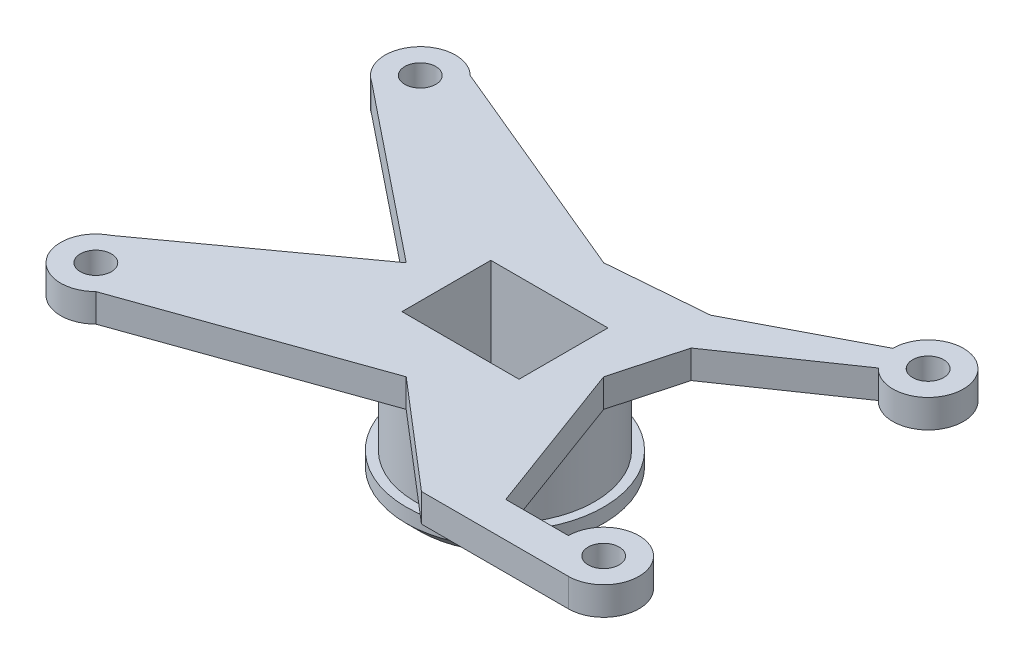
ISO-10303-21;
HEADER;
FILE_DESCRIPTION(('STEP AP214'),'2;1');
FILE_NAME('part.step','',(''),(''),'','','');
FILE_SCHEMA(('AUTOMOTIVE_DESIGN { 1 0 10303 214 1 1 1 1 }'));
ENDSEC;
DATA;
#1=APPLICATION_CONTEXT('core data for automotive mechanical design processes');
#2=APPLICATION_PROTOCOL_DEFINITION('international standard','automotive_design',2000,#1);
#3=PRODUCT_CONTEXT('',#1,'mechanical');
#4=PRODUCT('Part','Part','',(#3));
#5=PRODUCT_RELATED_PRODUCT_CATEGORY('part','',(#4));
#6=PRODUCT_DEFINITION_FORMATION('','',#4);
#7=PRODUCT_DEFINITION_CONTEXT('part definition',#1,'design');
#8=PRODUCT_DEFINITION('design','',#6,#7);
#9=PRODUCT_DEFINITION_SHAPE('','',#8);
#10=(LENGTH_UNIT() NAMED_UNIT(*) SI_UNIT(.MILLI.,.METRE.));
#11=(NAMED_UNIT(*) PLANE_ANGLE_UNIT() SI_UNIT($,.RADIAN.));
#12=(NAMED_UNIT(*) SI_UNIT($,.STERADIAN.) SOLID_ANGLE_UNIT());
#13=UNCERTAINTY_MEASURE_WITH_UNIT(LENGTH_MEASURE(1.E-05),#10,'distance_accuracy_value','');
#14=(GEOMETRIC_REPRESENTATION_CONTEXT(3) GLOBAL_UNCERTAINTY_ASSIGNED_CONTEXT((#13)) GLOBAL_UNIT_ASSIGNED_CONTEXT((#10,
#11,#12)) REPRESENTATION_CONTEXT('',''));
#15=CARTESIAN_POINT('',(0.,0.,0.));
#16=DIRECTION('',(0.,0.,1.));
#17=DIRECTION('',(1.,0.,0.));
#18=AXIS2_PLACEMENT_3D('',#15,#16,#17);
#19=CARTESIAN_POINT('',(0.,-5.,0.));
#20=DIRECTION('',(0.,1.,0.));
#21=DIRECTION('',(0.,0.,1.));
#22=AXIS2_PLACEMENT_3D('',#19,#20,#21);
#23=CYLINDRICAL_SURFACE('',#22,6.35);
#24=CARTESIAN_POINT('',(0.,0.35000000000001,0.));
#25=DIRECTION('',(0.,1.,0.));
#26=DIRECTION('',(0.,0.,1.));
#27=AXIS2_PLACEMENT_3D('',#24,#25,#26);
#28=CIRCLE('',#27,6.35);
#29=CARTESIAN_POINT('',(0.,0.35000000000001,6.35));
#30=VERTEX_POINT('',#29);
#31=EDGE_CURVE('E11',#30,#30,#28,.F.);
#32=ORIENTED_EDGE('',*,*,#31,.T.);
#33=EDGE_LOOP('',(#32));
#34=FACE_BOUND('',#33,.T.);
#35=CARTESIAN_POINT('',(0.,-5.,0.));
#36=DIRECTION('',(0.,1.,0.));
#37=DIRECTION('',(0.,0.,1.));
#38=AXIS2_PLACEMENT_3D('',#35,#36,#37);
#39=CIRCLE('',#38,6.35);
#40=CARTESIAN_POINT('',(0.,-5.,6.35));
#41=VERTEX_POINT('',#40);
#42=EDGE_CURVE('E293',#41,#41,#39,.T.);
#43=ORIENTED_EDGE('',*,*,#42,.T.);
#44=EDGE_LOOP('',(#43));
#45=FACE_BOUND('',#44,.T.);
#46=ADVANCED_FACE('F47',(#34,#45),#23,.T.);
#47=CARTESIAN_POINT('',(0.,-7.,0.));
#48=DIRECTION('',(0.,1.,0.));
#49=DIRECTION('',(0.,0.,1.));
#50=AXIS2_PLACEMENT_3D('',#47,#48,#49);
#51=CYLINDRICAL_SURFACE('',#50,7.);
#52=CARTESIAN_POINT('',(0.,-6.,0.));
#53=DIRECTION('',(0.,1.,0.));
#54=DIRECTION('',(0.,0.,1.));
#55=AXIS2_PLACEMENT_3D('',#52,#53,#54);
#56=CIRCLE('',#55,7.);
#57=CARTESIAN_POINT('',(0.,-6.,7.));
#58=VERTEX_POINT('',#57);
#59=EDGE_CURVE('E297',#58,#58,#56,.T.);
#60=ORIENTED_EDGE('',*,*,#59,.T.);
#61=EDGE_LOOP('',(#60));
#62=FACE_BOUND('',#61,.T.);
#63=CARTESIAN_POINT('',(0.,-5.,0.));
#64=DIRECTION('',(0.,1.,0.));
#65=DIRECTION('',(0.,0.,1.));
#66=AXIS2_PLACEMENT_3D('',#63,#64,#65);
#67=CIRCLE('',#66,7.);
#68=CARTESIAN_POINT('',(0.,-5.,7.));
#69=VERTEX_POINT('',#68);
#70=EDGE_CURVE('E281',#69,#69,#67,.T.);
#71=ORIENTED_EDGE('',*,*,#70,.F.);
#72=EDGE_LOOP('',(#71));
#73=FACE_BOUND('',#72,.T.);
#74=ADVANCED_FACE('F522',(#62,#73),#51,.T.);
#75=CARTESIAN_POINT('',(0.,-7.,0.));
#76=DIRECTION('',(0.,1.,0.));
#77=DIRECTION('',(0.,0.,1.));
#78=AXIS2_PLACEMENT_3D('',#75,#76,#77);
#79=PLANE('',#78);
#80=DIRECTION('',(-1.,0.,0.));
#81=VECTOR('',#80,1.);
#82=CARTESIAN_POINT('',(-4.15,-7.,3.15));
#83=LINE('',#82,#81);
#84=CARTESIAN_POINT('',(4.15,-7.,3.15));
#85=VERTEX_POINT('',#84);
#86=CARTESIAN_POINT('',(-4.15,-7.,3.15));
#87=VERTEX_POINT('',#86);
#88=EDGE_CURVE('E265',#85,#87,#83,.T.);
#89=ORIENTED_EDGE('',*,*,#88,.F.);
#90=DIRECTION('',(0.,0.,1.));
#91=VECTOR('',#90,1.);
#92=CARTESIAN_POINT('',(4.15,-7.,-3.15));
#93=LINE('',#92,#91);
#94=CARTESIAN_POINT('',(4.15,-7.,-3.15));
#95=VERTEX_POINT('',#94);
#96=EDGE_CURVE('E259',#95,#85,#93,.T.);
#97=ORIENTED_EDGE('',*,*,#96,.F.);
#98=DIRECTION('',(1.,0.,0.));
#99=VECTOR('',#98,1.);
#100=CARTESIAN_POINT('',(-4.15,-7.,-3.15));
#101=LINE('',#100,#99);
#102=CARTESIAN_POINT('',(-4.15,-7.,-3.15));
#103=VERTEX_POINT('',#102);
#104=EDGE_CURVE('E273',#103,#95,#101,.T.);
#105=ORIENTED_EDGE('',*,*,#104,.F.);
#106=DIRECTION('',(0.,0.,-1.));
#107=VECTOR('',#106,1.);
#108=CARTESIAN_POINT('',(-4.15,-7.,-3.15));
#109=LINE('',#108,#107);
#110=EDGE_CURVE('E269',#87,#103,#109,.T.);
#111=ORIENTED_EDGE('',*,*,#110,.F.);
#112=EDGE_LOOP('',(#89,#97,#105,#111));
#113=FACE_BOUND('',#112,.T.);
#114=CARTESIAN_POINT('',(0.,-7.,0.));
#115=DIRECTION('',(0.,1.,0.));
#116=DIRECTION('',(0.,0.,1.));
#117=AXIS2_PLACEMENT_3D('',#114,#115,#116);
#118=CIRCLE('',#117,5.99999999999999);
#119=CARTESIAN_POINT('',(0.,-7.,5.99999999999999));
#120=VERTEX_POINT('',#119);
#121=EDGE_CURVE('E301',#120,#120,#118,.F.);
#122=ORIENTED_EDGE('',*,*,#121,.T.);
#123=EDGE_LOOP('',(#122));
#124=FACE_BOUND('',#123,.T.);
#125=ADVANCED_FACE('F506',(#113,#124),#79,.F.);
#126=CARTESIAN_POINT('',(0.,-5.,0.));
#127=DIRECTION('',(0.,1.,0.));
#128=DIRECTION('',(0.,0.,1.));
#129=AXIS2_PLACEMENT_3D('',#126,#127,#128);
#130=PLANE('',#129);
#131=ORIENTED_EDGE('',*,*,#42,.F.);
#132=EDGE_LOOP('',(#131));
#133=FACE_BOUND('',#132,.T.);
#134=ORIENTED_EDGE('',*,*,#70,.T.);
#135=EDGE_LOOP('',(#134));
#136=FACE_BOUND('',#135,.T.);
#137=ADVANCED_FACE('F538',(#133,#136),#130,.T.);
#138=CARTESIAN_POINT('',(0.,-6.,0.));
#139=DIRECTION('',(0.,1.,0.));
#140=DIRECTION('',(0.,0.,1.));
#141=AXIS2_PLACEMENT_3D('',#138,#139,#140);
#142=CONICAL_SURFACE('',#141,7.,0.78539816339745);
#143=ORIENTED_EDGE('',*,*,#121,.F.);
#144=EDGE_LOOP('',(#143));
#145=FACE_BOUND('',#144,.T.);
#146=ORIENTED_EDGE('',*,*,#59,.F.);
#147=EDGE_LOOP('',(#146));
#148=FACE_BOUND('',#147,.T.);
#149=ADVANCED_FACE('F534',(#145,#148),#142,.T.);
#150=CARTESIAN_POINT('',(0.,1.00000000000002,0.));
#151=DIRECTION('',(0.,1.,0.));
#152=DIRECTION('',(0.,0.,1.));
#153=AXIS2_PLACEMENT_3D('',#150,#151,#152);
#154=CONICAL_SURFACE('',#153,7.,0.785398163397443);
#155=ORIENTED_EDGE('',*,*,#31,.F.);
#156=EDGE_LOOP('',(#155));
#157=FACE_BOUND('',#156,.T.);
#158=CARTESIAN_POINT('',(0.,1.00000000000002,0.));
#159=DIRECTION('',(0.,1.,0.));
#160=DIRECTION('',(0.,0.,1.));
#161=AXIS2_PLACEMENT_3D('',#158,#159,#160);
#162=CIRCLE('',#161,7.);
#163=CARTESIAN_POINT('',(0.,1.00000000000002,7.));
#164=VERTEX_POINT('',#163);
#165=CARTESIAN_POINT('',(7.,1.,0.));
#166=VERTEX_POINT('',#165);
#167=EDGE_CURVE('E57',#164,#166,#162,.T.);
#168=ORIENTED_EDGE('',*,*,#167,.F.);
#169=CARTESIAN_POINT('',(0.,1.,0.));
#170=DIRECTION('',(0.,1.,0.));
#171=DIRECTION('',(0.,0.,1.));
#172=AXIS2_PLACEMENT_3D('',#169,#170,#171);
#173=CIRCLE('',#172,6.99999999999998);
#174=CARTESIAN_POINT('',(-7.,1.00000000000002,0.));
#175=VERTEX_POINT('',#174);
#176=EDGE_CURVE('E255',#164,#175,#173,.F.);
#177=ORIENTED_EDGE('',*,*,#176,.T.);
#178=CARTESIAN_POINT('',(-2.36464493819089E-13,1.00000000000002,-7.));
#179=VERTEX_POINT('',#178);
#180=EDGE_CURVE('E260',#175,#179,#173,.F.);
#181=ORIENTED_EDGE('',*,*,#180,.T.);
#182=EDGE_CURVE('E261',#179,#166,#173,.F.);
#183=ORIENTED_EDGE('',*,*,#182,.T.);
#184=EDGE_LOOP('',(#168,#177,#181,#183));
#185=FACE_BOUND('',#184,.T.);
#186=ADVANCED_FACE('F50',(#157,#185),#154,.T.);
#187=CARTESIAN_POINT('',(4.15,2.,-3.15));
#188=DIRECTION('',(1.,0.,0.));
#189=DIRECTION('',(0.,0.,-1.));
#190=AXIS2_PLACEMENT_3D('',#187,#188,#189);
#191=PLANE('',#190);
#192=DIRECTION('',(0.,-1.,0.));
#193=VECTOR('',#192,1.);
#194=CARTESIAN_POINT('',(4.15,2.,-3.15));
#195=LINE('',#194,#193);
#196=CARTESIAN_POINT('',(4.15,3.,-3.15));
#197=VERTEX_POINT('',#196);
#198=EDGE_CURVE('E278',#197,#95,#195,.T.);
#199=ORIENTED_EDGE('',*,*,#198,.T.);
#200=ORIENTED_EDGE('',*,*,#96,.T.);
#201=DIRECTION('',(0.,-1.,0.));
#202=VECTOR('',#201,1.);
#203=CARTESIAN_POINT('',(4.15,2.,3.15));
#204=LINE('',#203,#202);
#205=CARTESIAN_POINT('',(4.15,3.,3.15));
#206=VERTEX_POINT('',#205);
#207=EDGE_CURVE('E277',#206,#85,#204,.T.);
#208=ORIENTED_EDGE('',*,*,#207,.F.);
#209=DIRECTION('',(0.,0.,-1.));
#210=VECTOR('',#209,1.);
#211=CARTESIAN_POINT('',(4.15,3.,3.15));
#212=LINE('',#211,#210);
#213=EDGE_CURVE('E453',#206,#197,#212,.T.);
#214=ORIENTED_EDGE('',*,*,#213,.T.);
#215=EDGE_LOOP('',(#199,#200,#208,#214));
#216=FACE_BOUND('',#215,.T.);
#217=ADVANCED_FACE('F500',(#216),#191,.F.);
#218=CARTESIAN_POINT('',(-4.15,2.,-3.15));
#219=DIRECTION('',(0.,0.,-1.));
#220=DIRECTION('',(-1.,0.,0.));
#221=AXIS2_PLACEMENT_3D('',#218,#219,#220);
#222=PLANE('',#221);
#223=DIRECTION('',(0.,-1.,0.));
#224=VECTOR('',#223,1.);
#225=CARTESIAN_POINT('',(-4.15,2.,-3.15));
#226=LINE('',#225,#224);
#227=CARTESIAN_POINT('',(-4.15,3.,-3.15));
#228=VERTEX_POINT('',#227);
#229=EDGE_CURVE('E282',#228,#103,#226,.T.);
#230=ORIENTED_EDGE('',*,*,#229,.T.);
#231=ORIENTED_EDGE('',*,*,#104,.T.);
#232=ORIENTED_EDGE('',*,*,#198,.F.);
#233=DIRECTION('',(-1.,0.,0.));
#234=VECTOR('',#233,1.);
#235=CARTESIAN_POINT('',(-4.15,3.,-3.15));
#236=LINE('',#235,#234);
#237=EDGE_CURVE('E483',#197,#228,#236,.T.);
#238=ORIENTED_EDGE('',*,*,#237,.T.);
#239=EDGE_LOOP('',(#230,#231,#232,#238));
#240=FACE_BOUND('',#239,.T.);
#241=ADVANCED_FACE('F511',(#240),#222,.F.);
#242=CARTESIAN_POINT('',(-4.15,2.,-3.15));
#243=DIRECTION('',(-1.,0.,0.));
#244=DIRECTION('',(0.,0.,1.));
#245=AXIS2_PLACEMENT_3D('',#242,#243,#244);
#246=PLANE('',#245);
#247=DIRECTION('',(0.,-1.,0.));
#248=VECTOR('',#247,1.);
#249=CARTESIAN_POINT('',(-4.15,2.,3.15));
#250=LINE('',#249,#248);
#251=CARTESIAN_POINT('',(-4.15,3.,3.15));
#252=VERTEX_POINT('',#251);
#253=EDGE_CURVE('E285',#252,#87,#250,.T.);
#254=ORIENTED_EDGE('',*,*,#253,.T.);
#255=ORIENTED_EDGE('',*,*,#110,.T.);
#256=ORIENTED_EDGE('',*,*,#229,.F.);
#257=DIRECTION('',(0.,0.,1.));
#258=VECTOR('',#257,1.);
#259=CARTESIAN_POINT('',(-4.15,3.,3.15));
#260=LINE('',#259,#258);
#261=EDGE_CURVE('E487',#228,#252,#260,.T.);
#262=ORIENTED_EDGE('',*,*,#261,.T.);
#263=EDGE_LOOP('',(#254,#255,#256,#262));
#264=FACE_BOUND('',#263,.T.);
#265=ADVANCED_FACE('F509',(#264),#246,.F.);
#266=CARTESIAN_POINT('',(-4.15,2.,3.15));
#267=DIRECTION('',(0.,0.,1.));
#268=DIRECTION('',(1.,0.,0.));
#269=AXIS2_PLACEMENT_3D('',#266,#267,#268);
#270=PLANE('',#269);
#271=ORIENTED_EDGE('',*,*,#207,.T.);
#272=ORIENTED_EDGE('',*,*,#88,.T.);
#273=ORIENTED_EDGE('',*,*,#253,.F.);
#274=DIRECTION('',(1.,0.,0.));
#275=VECTOR('',#274,1.);
#276=CARTESIAN_POINT('',(-4.15,3.,3.15));
#277=LINE('',#276,#275);
#278=EDGE_CURVE('E357',#252,#206,#277,.T.);
#279=ORIENTED_EDGE('',*,*,#278,.T.);
#280=EDGE_LOOP('',(#271,#272,#273,#279));
#281=FACE_BOUND('',#280,.T.);
#282=ADVANCED_FACE('F495',(#281),#270,.F.);
#283=CARTESIAN_POINT('',(-18.,1.,-12.));
#284=DIRECTION('',(0.,1.,0.));
#285=DIRECTION('',(0.,0.,1.));
#286=AXIS2_PLACEMENT_3D('',#283,#284,#285);
#287=PLANE('',#286);
#288=DIRECTION('',(-0.942282352549881,0.,0.334819306601429));
#289=VECTOR('',#288,1.);
#290=CARTESIAN_POINT('',(-16.2322330470336,1.,12.7677669529663));
#291=LINE('',#290,#289);
#292=CARTESIAN_POINT('',(-16.2322330470336,1.,12.7677669529663));
#293=VERTEX_POINT('',#292);
#294=EDGE_CURVE('E473',#164,#293,#291,.T.);
#295=ORIENTED_EDGE('',*,*,#294,.T.);
#296=CARTESIAN_POINT('',(-18.,1.,11.));
#297=DIRECTION('',(0.,1.,0.));
#298=DIRECTION('',(0.,0.,1.));
#299=AXIS2_PLACEMENT_3D('',#296,#297,#298);
#300=CIRCLE('',#299,2.5);
#301=CARTESIAN_POINT('',(-19.1248783853447,1.,8.76736733469558));
#302=VERTEX_POINT('',#301);
#303=EDGE_CURVE('E211',#302,#293,#300,.T.);
#304=ORIENTED_EDGE('',*,*,#303,.F.);
#305=DIRECTION('',(0.810345674789215,0.,-0.585952120356614));
#306=VECTOR('',#305,1.);
#307=CARTESIAN_POINT('',(-19.7677669529664,1.,9.23223304703364));
#308=LINE('',#307,#306);
#309=EDGE_CURVE('E64',#302,#175,#308,.T.);
#310=ORIENTED_EDGE('',*,*,#309,.T.);
#311=ORIENTED_EDGE('',*,*,#176,.F.);
#312=EDGE_LOOP('',(#295,#304,#310,#311));
#313=FACE_BOUND('',#312,.T.);
#314=CARTESIAN_POINT('',(-18.,1.,11.));
#315=DIRECTION('',(0.,1.,0.));
#316=DIRECTION('',(0.,0.,1.));
#317=AXIS2_PLACEMENT_3D('',#314,#315,#316);
#318=CIRCLE('',#317,1.1);
#319=CARTESIAN_POINT('',(-18.,1.,12.1));
#320=VERTEX_POINT('',#319);
#321=EDGE_CURVE('E196',#320,#320,#318,.T.);
#322=ORIENTED_EDGE('',*,*,#321,.T.);
#323=EDGE_LOOP('',(#322));
#324=FACE_BOUND('',#323,.T.);
#325=ADVANCED_FACE('F557',(#313,#324),#287,.F.);
#326=CARTESIAN_POINT('',(-18.,1.,-12.));
#327=DIRECTION('',(0.,1.,0.));
#328=DIRECTION('',(0.,0.,1.));
#329=AXIS2_PLACEMENT_3D('',#326,#327,#328);
#330=CIRCLE('',#329,2.5);
#331=CARTESIAN_POINT('',(-16.2322330470337,1.,-13.7677669529664));
#332=VERTEX_POINT('',#331);
#333=CARTESIAN_POINT('',(-19.340236025644,1.,-9.8896049195551));
#334=VERTEX_POINT('',#333);
#335=EDGE_CURVE('E446',#332,#334,#330,.T.);
#336=ORIENTED_EDGE('',*,*,#335,.F.);
#337=DIRECTION('',(0.922989355648171,0.,0.384825479094323));
#338=VECTOR('',#337,1.);
#339=CARTESIAN_POINT('',(-16.2322330470337,1.,-13.7677669529664));
#340=LINE('',#339,#338);
#341=EDGE_CURVE('E464',#332,#179,#340,.T.);
#342=ORIENTED_EDGE('',*,*,#341,.T.);
#343=ORIENTED_EDGE('',*,*,#180,.F.);
#344=DIRECTION('',(-0.780331300184989,0.,-0.625366342196001));
#345=VECTOR('',#344,1.);
#346=CARTESIAN_POINT('',(-19.7677669529664,1.,-10.2322330470336));
#347=LINE('',#346,#345);
#348=EDGE_CURVE('E467',#175,#334,#347,.T.);
#349=ORIENTED_EDGE('',*,*,#348,.T.);
#350=EDGE_LOOP('',(#336,#342,#343,#349));
#351=FACE_BOUND('',#350,.T.);
#352=CARTESIAN_POINT('',(-18.,1.,-12.));
#353=DIRECTION('',(0.,1.,0.));
#354=DIRECTION('',(0.,0.,1.));
#355=AXIS2_PLACEMENT_3D('',#352,#353,#354);
#356=CIRCLE('',#355,1.1);
#357=CARTESIAN_POINT('',(-18.,1.,-10.9));
#358=VERTEX_POINT('',#357);
#359=EDGE_CURVE('E442',#358,#358,#356,.T.);
#360=ORIENTED_EDGE('',*,*,#359,.T.);
#361=EDGE_LOOP('',(#360));
#362=FACE_BOUND('',#361,.T.);
#363=ADVANCED_FACE('F561',(#351,#362),#287,.F.);
#364=DIRECTION('',(0.886882623351324,0.,-0.461994818582928));
#365=VECTOR('',#364,1.);
#366=CARTESIAN_POINT('',(7.,1.,-7.57218074347219));
#367=LINE('',#366,#365);
#368=CARTESIAN_POINT('',(7.,1.,-7.57218074347219));
#369=VERTEX_POINT('',#368);
#370=CARTESIAN_POINT('',(15.5,1.,-12.));
#371=VERTEX_POINT('',#370);
#372=EDGE_CURVE('E458',#369,#371,#367,.T.);
#373=ORIENTED_EDGE('',*,*,#372,.T.);
#374=CARTESIAN_POINT('',(18.,1.,-12.));
#375=DIRECTION('',(0.,1.,0.));
#376=DIRECTION('',(0.,0.,1.));
#377=AXIS2_PLACEMENT_3D('',#374,#375,#376);
#378=CIRCLE('',#377,2.5);
#379=CARTESIAN_POINT('',(16.1924342957977,1.,-10.2729486906893));
#380=VERTEX_POINT('',#379);
#381=EDGE_CURVE('E419',#380,#371,#378,.T.);
#382=ORIENTED_EDGE('',*,*,#381,.F.);
#383=DIRECTION('',(-0.823968929567635,0.,0.566634982247977));
#384=VECTOR('',#383,1.);
#385=CARTESIAN_POINT('',(8.33451426127763,1.,-4.86913767368563));
#386=LINE('',#385,#384);
#387=CARTESIAN_POINT('',(8.33451426127763,1.,-4.86913767368563));
#388=VERTEX_POINT('',#387);
#389=EDGE_CURVE('E327',#380,#388,#386,.T.);
#390=ORIENTED_EDGE('',*,*,#389,.T.);
#391=DIRECTION('',(-0.264327992330558,0.,0.964432844977034));
#392=VECTOR('',#391,1.);
#393=CARTESIAN_POINT('',(7.,1.,0.));
#394=LINE('',#393,#392);
#395=EDGE_CURVE('E322',#388,#166,#394,.T.);
#396=ORIENTED_EDGE('',*,*,#395,.T.);
#397=ORIENTED_EDGE('',*,*,#182,.F.);
#398=DIRECTION('',(0.996675925490363,0.,-0.0814683960068446));
#399=VECTOR('',#398,1.);
#400=CARTESIAN_POINT('',(0.,1.,-7.));
#401=LINE('',#400,#399);
#402=EDGE_CURVE('E461',#179,#369,#401,.T.);
#403=ORIENTED_EDGE('',*,*,#402,.T.);
#404=EDGE_LOOP('',(#373,#382,#390,#396,#397,#403));
#405=FACE_BOUND('',#404,.T.);
#406=CARTESIAN_POINT('',(18.,1.,-12.));
#407=DIRECTION('',(0.,1.,0.));
#408=DIRECTION('',(0.,0.,1.));
#409=AXIS2_PLACEMENT_3D('',#406,#407,#408);
#410=CIRCLE('',#409,1.1);
#411=CARTESIAN_POINT('',(18.,1.,-10.9));
#412=VERTEX_POINT('',#411);
#413=EDGE_CURVE('E423',#412,#412,#410,.T.);
#414=ORIENTED_EDGE('',*,*,#413,.T.);
#415=EDGE_LOOP('',(#414));
#416=FACE_BOUND('',#415,.T.);
#417=ADVANCED_FACE('F323',(#405,#416),#287,.F.);
#418=CARTESIAN_POINT('',(15.5,-45.5825647127213,11.));
#419=DIRECTION('',(0.,0.,-1.));
#420=DIRECTION('',(-1.,0.,0.));
#421=AXIS2_PLACEMENT_3D('',#418,#419,#420);
#422=PLANE('',#421);
#423=DIRECTION('',(1.,0.,0.));
#424=VECTOR('',#423,1.);
#425=CARTESIAN_POINT('',(15.5,1.,11.));
#426=LINE('',#425,#424);
#427=CARTESIAN_POINT('',(11.058001897193,1.,11.));
#428=VERTEX_POINT('',#427);
#429=CARTESIAN_POINT('',(15.5,1.,11.));
#430=VERTEX_POINT('',#429);
#431=EDGE_CURVE('E401',#428,#430,#426,.T.);
#432=ORIENTED_EDGE('',*,*,#431,.F.);
#433=DIRECTION('',(0.,1.,0.));
#434=VECTOR('',#433,1.);
#435=CARTESIAN_POINT('',(11.058001897193,-45.5825647127213,11.));
#436=LINE('',#435,#434);
#437=CARTESIAN_POINT('',(11.058001897193,3.,11.));
#438=VERTEX_POINT('',#437);
#439=EDGE_CURVE('E247',#428,#438,#436,.T.);
#440=ORIENTED_EDGE('',*,*,#439,.T.);
#441=DIRECTION('',(-1.,0.,0.));
#442=VECTOR('',#441,1.);
#443=CARTESIAN_POINT('',(15.5,3.,11.));
#444=LINE('',#443,#442);
#445=CARTESIAN_POINT('',(15.5,3.,11.));
#446=VERTEX_POINT('',#445);
#447=EDGE_CURVE('E353',#446,#438,#444,.T.);
#448=ORIENTED_EDGE('',*,*,#447,.F.);
#449=DIRECTION('',(0.,1.,0.));
#450=VECTOR('',#449,1.);
#451=CARTESIAN_POINT('',(15.5,-45.5825647127213,11.));
#452=LINE('',#451,#450);
#453=EDGE_CURVE('E250',#430,#446,#452,.T.);
#454=ORIENTED_EDGE('',*,*,#453,.F.);
#455=EDGE_LOOP('',(#432,#440,#448,#454));
#456=FACE_BOUND('',#455,.T.);
#457=ADVANCED_FACE('F580',(#456),#422,.T.);
#458=CARTESIAN_POINT('',(11.058001897193,-45.5825647127213,11.));
#459=DIRECTION('',(0.938194447540681,0.,-0.346108622550547));
#460=DIRECTION('',(-0.346108622550547,0.,-0.938194447540681));
#461=AXIS2_PLACEMENT_3D('',#458,#459,#460);
#462=PLANE('',#461);
#463=DIRECTION('',(0.346108622550547,0.,0.938194447540681));
#464=VECTOR('',#463,1.);
#465=CARTESIAN_POINT('',(11.058001897193,1.,11.));
#466=LINE('',#465,#464);
#467=EDGE_CURVE('E313',#166,#428,#466,.T.);
#468=ORIENTED_EDGE('',*,*,#467,.F.);
#469=DIRECTION('',(0.,1.,0.));
#470=VECTOR('',#469,1.);
#471=CARTESIAN_POINT('',(7.,-45.5825647127213,0.));
#472=LINE('',#471,#470);
#473=CARTESIAN_POINT('',(7.,3.,0.));
#474=VERTEX_POINT('',#473);
#475=EDGE_CURVE('E244',#166,#474,#472,.T.);
#476=ORIENTED_EDGE('',*,*,#475,.T.);
#477=DIRECTION('',(-0.346108622550547,0.,-0.938194447540681));
#478=VECTOR('',#477,1.);
#479=CARTESIAN_POINT('',(11.058001897193,3.,11.));
#480=LINE('',#479,#478);
#481=EDGE_CURVE('E349',#438,#474,#480,.T.);
#482=ORIENTED_EDGE('',*,*,#481,.F.);
#483=ORIENTED_EDGE('',*,*,#439,.F.);
#484=EDGE_LOOP('',(#468,#476,#482,#483));
#485=FACE_BOUND('',#484,.T.);
#486=ADVANCED_FACE('F334',(#485),#462,.T.);
#487=CARTESIAN_POINT('',(7.,-45.5825647127213,0.));
#488=DIRECTION('',(0.964432844977034,0.,0.264327992330558));
#489=DIRECTION('',(0.264327992330558,0.,-0.964432844977034));
#490=AXIS2_PLACEMENT_3D('',#487,#488,#489);
#491=PLANE('',#490);
#492=ORIENTED_EDGE('',*,*,#395,.F.);
#493=DIRECTION('',(0.,1.,0.));
#494=VECTOR('',#493,1.);
#495=CARTESIAN_POINT('',(8.33451426127763,-45.5825647127213,-4.86913767368563));
#496=LINE('',#495,#494);
#497=CARTESIAN_POINT('',(8.33451426127763,3.,-4.86913767368563));
#498=VERTEX_POINT('',#497);
#499=EDGE_CURVE('E241',#388,#498,#496,.T.);
#500=ORIENTED_EDGE('',*,*,#499,.T.);
#501=DIRECTION('',(0.264327992330558,0.,-0.964432844977034));
#502=VECTOR('',#501,1.);
#503=CARTESIAN_POINT('',(7.,3.,0.));
#504=LINE('',#503,#502);
#505=EDGE_CURVE('E343',#474,#498,#504,.T.);
#506=ORIENTED_EDGE('',*,*,#505,.F.);
#507=ORIENTED_EDGE('',*,*,#475,.F.);
#508=EDGE_LOOP('',(#492,#500,#506,#507));
#509=FACE_BOUND('',#508,.T.);
#510=ADVANCED_FACE('F341',(#509),#491,.T.);
#511=CARTESIAN_POINT('',(8.33451426127763,-45.5825647127213,-4.86913767368563));
#512=DIRECTION('',(0.566634982247977,0.,0.823968929567635));
#513=DIRECTION('',(0.823968929567635,0.,-0.566634982247977));
#514=AXIS2_PLACEMENT_3D('',#511,#512,#513);
#515=PLANE('',#514);
#516=ORIENTED_EDGE('',*,*,#389,.F.);
#517=DIRECTION('',(0.,1.,0.));
#518=VECTOR('',#517,1.);
#519=CARTESIAN_POINT('',(16.1924342957977,-45.5825647127213,-10.2729486906893));
#520=LINE('',#519,#518);
#521=CARTESIAN_POINT('',(16.1924342957977,3.,-10.2729486906893));
#522=VERTEX_POINT('',#521);
#523=EDGE_CURVE('E238',#380,#522,#520,.T.);
#524=ORIENTED_EDGE('',*,*,#523,.T.);
#525=DIRECTION('',(0.823968929567635,0.,-0.566634982247977));
#526=VECTOR('',#525,1.);
#527=CARTESIAN_POINT('',(8.33451426127763,3.,-4.86913767368563));
#528=LINE('',#527,#526);
#529=EDGE_CURVE('E348',#498,#522,#528,.T.);
#530=ORIENTED_EDGE('',*,*,#529,.F.);
#531=ORIENTED_EDGE('',*,*,#499,.F.);
#532=EDGE_LOOP('',(#516,#524,#530,#531));
#533=FACE_BOUND('',#532,.T.);
#534=ADVANCED_FACE('F592',(#533),#515,.T.);
#535=CARTESIAN_POINT('',(7.,-45.5825647127213,-7.57218074347219));
#536=DIRECTION('',(-0.461994818582928,0.,-0.886882623351324));
#537=DIRECTION('',(-0.886882623351324,0.,0.461994818582928));
#538=AXIS2_PLACEMENT_3D('',#535,#536,#537);
#539=PLANE('',#538);
#540=ORIENTED_EDGE('',*,*,#372,.F.);
#541=DIRECTION('',(0.,1.,0.));
#542=VECTOR('',#541,1.);
#543=CARTESIAN_POINT('',(7.,-45.5825647127213,-7.57218074347219));
#544=LINE('',#543,#542);
#545=CARTESIAN_POINT('',(7.,3.,-7.57218074347219));
#546=VERTEX_POINT('',#545);
#547=EDGE_CURVE('E231',#369,#546,#544,.T.);
#548=ORIENTED_EDGE('',*,*,#547,.T.);
#549=DIRECTION('',(-0.886882623351324,0.,0.461994818582928));
#550=VECTOR('',#549,1.);
#551=CARTESIAN_POINT('',(7.,3.,-7.57218074347219));
#552=LINE('',#551,#550);
#553=CARTESIAN_POINT('',(15.5,3.,-12.));
#554=VERTEX_POINT('',#553);
#555=EDGE_CURVE('E363',#554,#546,#552,.T.);
#556=ORIENTED_EDGE('',*,*,#555,.F.);
#557=DIRECTION('',(0.,1.,0.));
#558=VECTOR('',#557,1.);
#559=CARTESIAN_POINT('',(15.5,-45.5825647127213,-12.));
#560=LINE('',#559,#558);
#561=EDGE_CURVE('E234',#371,#554,#560,.T.);
#562=ORIENTED_EDGE('',*,*,#561,.F.);
#563=EDGE_LOOP('',(#540,#548,#556,#562));
#564=FACE_BOUND('',#563,.T.);
#565=ADVANCED_FACE('F595',(#564),#539,.T.);
#566=CARTESIAN_POINT('',(0.,-45.5825647127213,-7.));
#567=DIRECTION('',(-0.0814683960068446,0.,-0.996675925490363));
#568=DIRECTION('',(-0.996675925490363,0.,0.0814683960068446));
#569=AXIS2_PLACEMENT_3D('',#566,#567,#568);
#570=PLANE('',#569);
#571=ORIENTED_EDGE('',*,*,#402,.F.);
#572=DIRECTION('',(0.,1.,0.));
#573=VECTOR('',#572,1.);
#574=CARTESIAN_POINT('',(0.,-45.5825647127213,-7.));
#575=LINE('',#574,#573);
#576=CARTESIAN_POINT('',(0.,3.,-7.));
#577=VERTEX_POINT('',#576);
#578=EDGE_CURVE('E228',#179,#577,#575,.T.);
#579=ORIENTED_EDGE('',*,*,#578,.T.);
#580=DIRECTION('',(-0.996675925490363,0.,0.0814683960068446));
#581=VECTOR('',#580,1.);
#582=CARTESIAN_POINT('',(0.,3.,-7.));
#583=LINE('',#582,#581);
#584=EDGE_CURVE('E367',#546,#577,#583,.T.);
#585=ORIENTED_EDGE('',*,*,#584,.F.);
#586=ORIENTED_EDGE('',*,*,#547,.F.);
#587=EDGE_LOOP('',(#571,#579,#585,#586));
#588=FACE_BOUND('',#587,.T.);
#589=ADVANCED_FACE('F599',(#588),#570,.T.);
#590=CARTESIAN_POINT('',(-16.2322330470337,-45.5825647127213,-13.7677669529664));
#591=DIRECTION('',(0.384825479094323,0.,-0.92298935564817));
#592=DIRECTION('',(-0.922989355648171,0.,-0.384825479094323));
#593=AXIS2_PLACEMENT_3D('',#590,#591,#592);
#594=PLANE('',#593);
#595=ORIENTED_EDGE('',*,*,#341,.F.);
#596=DIRECTION('',(0.,1.,0.));
#597=VECTOR('',#596,1.);
#598=CARTESIAN_POINT('',(-16.2322330470337,-45.5825647127213,-13.7677669529664));
#599=LINE('',#598,#597);
#600=CARTESIAN_POINT('',(-16.2322330470337,3.,-13.7677669529664));
#601=VERTEX_POINT('',#600);
#602=EDGE_CURVE('E221',#332,#601,#599,.T.);
#603=ORIENTED_EDGE('',*,*,#602,.T.);
#604=DIRECTION('',(-0.92298935564817,0.,-0.384825479094323));
#605=VECTOR('',#604,1.);
#606=CARTESIAN_POINT('',(-16.2322330470337,3.,-13.7677669529664));
#607=LINE('',#606,#605);
#608=EDGE_CURVE('E371',#577,#601,#607,.T.);
#609=ORIENTED_EDGE('',*,*,#608,.F.);
#610=ORIENTED_EDGE('',*,*,#578,.F.);
#611=EDGE_LOOP('',(#595,#603,#609,#610));
#612=FACE_BOUND('',#611,.T.);
#613=ADVANCED_FACE('F603',(#612),#594,.T.);
#614=CARTESIAN_POINT('',(-19.7677669529664,-45.5825647127213,-10.2322330470336));
#615=DIRECTION('',(-0.625366342196001,0.,0.780331300184989));
#616=DIRECTION('',(0.780331300184989,0.,0.625366342196001));
#617=AXIS2_PLACEMENT_3D('',#614,#615,#616);
#618=PLANE('',#617);
#619=DIRECTION('',(0.,1.,0.));
#620=VECTOR('',#619,1.);
#621=CARTESIAN_POINT('',(-19.340236025644,1.,-9.88960491955509));
#622=LINE('',#621,#620);
#623=CARTESIAN_POINT('',(-19.340236025644,3.,-9.88960491955509));
#624=VERTEX_POINT('',#623);
#625=EDGE_CURVE('E449',#334,#624,#622,.T.);
#626=ORIENTED_EDGE('',*,*,#625,.F.);
#627=ORIENTED_EDGE('',*,*,#348,.F.);
#628=DIRECTION('',(0.,1.,0.));
#629=VECTOR('',#628,1.);
#630=CARTESIAN_POINT('',(-7.,-45.5825647127213,0.));
#631=LINE('',#630,#629);
#632=CARTESIAN_POINT('',(-7.,3.,0.));
#633=VERTEX_POINT('',#632);
#634=EDGE_CURVE('E214',#175,#633,#631,.T.);
#635=ORIENTED_EDGE('',*,*,#634,.T.);
#636=DIRECTION('',(0.780331300184989,0.,0.625366342196001));
#637=VECTOR('',#636,1.);
#638=CARTESIAN_POINT('',(-19.7677669529664,3.,-10.2322330470336));
#639=LINE('',#638,#637);
#640=EDGE_CURVE('E375',#624,#633,#639,.T.);
#641=ORIENTED_EDGE('',*,*,#640,.F.);
#642=EDGE_LOOP('',(#626,#627,#635,#641));
#643=FACE_BOUND('',#642,.T.);
#644=ADVANCED_FACE('F607',(#643),#618,.T.);
#645=CARTESIAN_POINT('',(-19.7677669529664,-45.5825647127213,9.23223304703364));
#646=DIRECTION('',(-0.585952120356614,0.,-0.810345674789215));
#647=DIRECTION('',(-0.810345674789215,0.,0.585952120356614));
#648=AXIS2_PLACEMENT_3D('',#645,#646,#647);
#649=PLANE('',#648);
#650=DIRECTION('',(0.,1.,0.));
#651=VECTOR('',#650,1.);
#652=CARTESIAN_POINT('',(-19.1248783853447,1.,8.76736733469558));
#653=LINE('',#652,#651);
#654=CARTESIAN_POINT('',(-19.1248783853447,3.,8.76736733469558));
#655=VERTEX_POINT('',#654);
#656=EDGE_CURVE('E68',#655,#302,#653,.F.);
#657=ORIENTED_EDGE('',*,*,#656,.F.);
#658=DIRECTION('',(-0.810345674789215,0.,0.585952120356614));
#659=VECTOR('',#658,1.);
#660=CARTESIAN_POINT('',(-19.7677669529664,3.,9.23223304703364));
#661=LINE('',#660,#659);
#662=EDGE_CURVE('E191',#633,#655,#661,.T.);
#663=ORIENTED_EDGE('',*,*,#662,.F.);
#664=ORIENTED_EDGE('',*,*,#634,.F.);
#665=ORIENTED_EDGE('',*,*,#309,.F.);
#666=EDGE_LOOP('',(#657,#663,#664,#665));
#667=FACE_BOUND('',#666,.T.);
#668=ADVANCED_FACE('F611',(#667),#649,.T.);
#669=CARTESIAN_POINT('',(-16.2322330470336,-45.5825647127213,12.7677669529663));
#670=DIRECTION('',(0.334819306601429,0.,0.942282352549881));
#671=DIRECTION('',(0.942282352549881,0.,-0.334819306601429));
#672=AXIS2_PLACEMENT_3D('',#669,#670,#671);
#673=PLANE('',#672);
#674=ORIENTED_EDGE('',*,*,#294,.F.);
#675=DIRECTION('',(0.,1.,0.));
#676=VECTOR('',#675,1.);
#677=CARTESIAN_POINT('',(0.,-45.5825647127213,7.));
#678=LINE('',#677,#676);
#679=CARTESIAN_POINT('',(0.,3.,7.));
#680=VERTEX_POINT('',#679);
#681=EDGE_CURVE('E204',#164,#680,#678,.T.);
#682=ORIENTED_EDGE('',*,*,#681,.T.);
#683=DIRECTION('',(0.942282352549881,0.,-0.334819306601429));
#684=VECTOR('',#683,1.);
#685=CARTESIAN_POINT('',(-16.2322330470336,3.,12.7677669529663));
#686=LINE('',#685,#684);
#687=CARTESIAN_POINT('',(-16.2322330470336,3.,12.7677669529664));
#688=VERTEX_POINT('',#687);
#689=EDGE_CURVE('E190',#688,#680,#686,.T.);
#690=ORIENTED_EDGE('',*,*,#689,.F.);
#691=DIRECTION('',(0.,1.,0.));
#692=VECTOR('',#691,1.);
#693=CARTESIAN_POINT('',(-16.2322330470336,-45.5825647127213,12.7677669529663));
#694=LINE('',#693,#692);
#695=EDGE_CURVE('E202',#293,#688,#694,.T.);
#696=ORIENTED_EDGE('',*,*,#695,.F.);
#697=EDGE_LOOP('',(#674,#682,#690,#696));
#698=FACE_BOUND('',#697,.T.);
#699=ADVANCED_FACE('F201',(#698),#673,.T.);
#700=CARTESIAN_POINT('',(7.58300358312492,-45.5825647127213,13.5));
#701=DIRECTION('',(-0.650807687091732,0.,0.7592426189449));
#702=DIRECTION('',(0.7592426189449,0.,0.650807687091732));
#703=AXIS2_PLACEMENT_3D('',#700,#701,#702);
#704=PLANE('',#703);
#705=DIRECTION('',(-0.7592426189449,0.,-0.650807687091732));
#706=VECTOR('',#705,1.);
#707=CARTESIAN_POINT('',(7.58300358312492,1.,13.5));
#708=LINE('',#707,#706);
#709=CARTESIAN_POINT('',(7.58300358312492,1.,13.5));
#710=VERTEX_POINT('',#709);
#711=EDGE_CURVE('E316',#710,#164,#708,.T.);
#712=ORIENTED_EDGE('',*,*,#711,.F.);
#713=DIRECTION('',(0.,1.,0.));
#714=VECTOR('',#713,1.);
#715=CARTESIAN_POINT('',(7.58300358312492,-45.5825647127213,13.5));
#716=LINE('',#715,#714);
#717=CARTESIAN_POINT('',(7.58300358312492,3.,13.5));
#718=VERTEX_POINT('',#717);
#719=EDGE_CURVE('E218',#710,#718,#716,.T.);
#720=ORIENTED_EDGE('',*,*,#719,.T.);
#721=DIRECTION('',(0.7592426189449,0.,0.650807687091732));
#722=VECTOR('',#721,1.);
#723=CARTESIAN_POINT('',(7.58300358312492,3.,13.5));
#724=LINE('',#723,#722);
#725=EDGE_CURVE('E207',#680,#718,#724,.T.);
#726=ORIENTED_EDGE('',*,*,#725,.F.);
#727=ORIENTED_EDGE('',*,*,#681,.F.);
#728=EDGE_LOOP('',(#712,#720,#726,#727));
#729=FACE_BOUND('',#728,.T.);
#730=ADVANCED_FACE('F390',(#729),#704,.T.);
#731=CARTESIAN_POINT('',(18.,-45.5825647127213,13.5));
#732=DIRECTION('',(0.,0.,1.));
#733=DIRECTION('',(1.,0.,0.));
#734=AXIS2_PLACEMENT_3D('',#731,#732,#733);
#735=PLANE('',#734);
#736=DIRECTION('',(-1.,0.,0.));
#737=VECTOR('',#736,1.);
#738=CARTESIAN_POINT('',(18.,1.,13.5));
#739=LINE('',#738,#737);
#740=CARTESIAN_POINT('',(18.,1.,13.5));
#741=VERTEX_POINT('',#740);
#742=EDGE_CURVE('E395',#741,#710,#739,.T.);
#743=ORIENTED_EDGE('',*,*,#742,.F.);
#744=DIRECTION('',(0.,1.,0.));
#745=VECTOR('',#744,1.);
#746=CARTESIAN_POINT('',(18.,-45.5825647127213,13.5));
#747=LINE('',#746,#745);
#748=CARTESIAN_POINT('',(18.,3.,13.5));
#749=VERTEX_POINT('',#748);
#750=EDGE_CURVE('E339',#741,#749,#747,.T.);
#751=ORIENTED_EDGE('',*,*,#750,.T.);
#752=DIRECTION('',(1.,0.,0.));
#753=VECTOR('',#752,1.);
#754=CARTESIAN_POINT('',(18.,3.,13.5));
#755=LINE('',#754,#753);
#756=EDGE_CURVE('E254',#718,#749,#755,.T.);
#757=ORIENTED_EDGE('',*,*,#756,.F.);
#758=ORIENTED_EDGE('',*,*,#719,.F.);
#759=EDGE_LOOP('',(#743,#751,#757,#758));
#760=FACE_BOUND('',#759,.T.);
#761=ADVANCED_FACE('F394',(#760),#735,.T.);
#762=CARTESIAN_POINT('',(0.,3.,0.));
#763=DIRECTION('',(0.,1.,0.));
#764=DIRECTION('',(0.,0.,1.));
#765=AXIS2_PLACEMENT_3D('',#762,#763,#764);
#766=PLANE('',#765);
#767=ORIENTED_EDGE('',*,*,#662,.T.);
#768=CARTESIAN_POINT('',(-18.,3.,11.));
#769=DIRECTION('',(0.,1.,0.));
#770=DIRECTION('',(0.,0.,1.));
#771=AXIS2_PLACEMENT_3D('',#768,#769,#770);
#772=CIRCLE('',#771,2.5);
#773=EDGE_CURVE('E185',#655,#688,#772,.T.);
#774=ORIENTED_EDGE('',*,*,#773,.T.);
#775=ORIENTED_EDGE('',*,*,#689,.T.);
#776=ORIENTED_EDGE('',*,*,#725,.T.);
#777=ORIENTED_EDGE('',*,*,#756,.T.);
#778=CARTESIAN_POINT('',(18.,3.,11.));
#779=DIRECTION('',(0.,1.,0.));
#780=DIRECTION('',(0.,0.,1.));
#781=AXIS2_PLACEMENT_3D('',#778,#779,#780);
#782=CIRCLE('',#781,2.5);
#783=EDGE_CURVE('E400',#749,#446,#782,.T.);
#784=ORIENTED_EDGE('',*,*,#783,.T.);
#785=ORIENTED_EDGE('',*,*,#447,.T.);
#786=ORIENTED_EDGE('',*,*,#481,.T.);
#787=ORIENTED_EDGE('',*,*,#505,.T.);
#788=ORIENTED_EDGE('',*,*,#529,.T.);
#789=CARTESIAN_POINT('',(18.,3.,-12.));
#790=DIRECTION('',(0.,1.,0.));
#791=DIRECTION('',(0.,0.,1.));
#792=AXIS2_PLACEMENT_3D('',#789,#790,#791);
#793=CIRCLE('',#792,2.5);
#794=EDGE_CURVE('E427',#522,#554,#793,.T.);
#795=ORIENTED_EDGE('',*,*,#794,.T.);
#796=ORIENTED_EDGE('',*,*,#555,.T.);
#797=ORIENTED_EDGE('',*,*,#584,.T.);
#798=ORIENTED_EDGE('',*,*,#608,.T.);
#799=CARTESIAN_POINT('',(-18.,3.,-12.));
#800=DIRECTION('',(0.,1.,0.));
#801=DIRECTION('',(0.,0.,1.));
#802=AXIS2_PLACEMENT_3D('',#799,#800,#801);
#803=CIRCLE('',#802,2.5);
#804=EDGE_CURVE('E439',#601,#624,#803,.T.);
#805=ORIENTED_EDGE('',*,*,#804,.T.);
#806=ORIENTED_EDGE('',*,*,#640,.T.);
#807=EDGE_LOOP('',(#767,#774,#775,#776,#777,#784,#785,#786,#787,#788,#795,#796,#797,#798,#805,#806));
#808=FACE_BOUND('',#807,.T.);
#809=ORIENTED_EDGE('',*,*,#213,.F.);
#810=ORIENTED_EDGE('',*,*,#278,.F.);
#811=ORIENTED_EDGE('',*,*,#261,.F.);
#812=ORIENTED_EDGE('',*,*,#237,.F.);
#813=EDGE_LOOP('',(#809,#810,#811,#812));
#814=FACE_BOUND('',#813,.T.);
#815=CARTESIAN_POINT('',(-18.,3.,-12.));
#816=DIRECTION('',(0.,1.,0.));
#817=DIRECTION('',(0.,0.,1.));
#818=AXIS2_PLACEMENT_3D('',#815,#816,#817);
#819=CIRCLE('',#818,1.1);
#820=CARTESIAN_POINT('',(-18.,3.,-10.9));
#821=VERTEX_POINT('',#820);
#822=EDGE_CURVE('E435',#821,#821,#819,.T.);
#823=ORIENTED_EDGE('',*,*,#822,.F.);
#824=EDGE_LOOP('',(#823));
#825=FACE_BOUND('',#824,.T.);
#826=CARTESIAN_POINT('',(18.,3.,-12.));
#827=DIRECTION('',(0.,1.,0.));
#828=DIRECTION('',(0.,0.,1.));
#829=AXIS2_PLACEMENT_3D('',#826,#827,#828);
#830=CIRCLE('',#829,1.1);
#831=CARTESIAN_POINT('',(18.,3.,-10.9));
#832=VERTEX_POINT('',#831);
#833=EDGE_CURVE('E431',#832,#832,#830,.T.);
#834=ORIENTED_EDGE('',*,*,#833,.F.);
#835=EDGE_LOOP('',(#834));
#836=FACE_BOUND('',#835,.T.);
#837=CARTESIAN_POINT('',(18.,3.,11.));
#838=DIRECTION('',(0.,1.,0.));
#839=DIRECTION('',(0.,0.,1.));
#840=AXIS2_PLACEMENT_3D('',#837,#838,#839);
#841=CIRCLE('',#840,1.1);
#842=CARTESIAN_POINT('',(18.,3.,12.1));
#843=VERTEX_POINT('',#842);
#844=EDGE_CURVE('E415',#843,#843,#841,.T.);
#845=ORIENTED_EDGE('',*,*,#844,.F.);
#846=EDGE_LOOP('',(#845));
#847=FACE_BOUND('',#846,.T.);
#848=CARTESIAN_POINT('',(-18.,3.,11.));
#849=DIRECTION('',(0.,1.,0.));
#850=DIRECTION('',(0.,0.,1.));
#851=AXIS2_PLACEMENT_3D('',#848,#849,#850);
#852=CIRCLE('',#851,1.1);
#853=CARTESIAN_POINT('',(-18.,3.,12.1));
#854=VERTEX_POINT('',#853);
#855=EDGE_CURVE('E195',#854,#854,#852,.T.);
#856=ORIENTED_EDGE('',*,*,#855,.F.);
#857=EDGE_LOOP('',(#856));
#858=FACE_BOUND('',#857,.T.);
#859=ADVANCED_FACE('F187',(#808,#814,#825,#836,#847,#858),#766,.T.);
#860=ORIENTED_EDGE('',*,*,#431,.T.);
#861=CARTESIAN_POINT('',(18.,1.,11.));
#862=DIRECTION('',(0.,1.,0.));
#863=DIRECTION('',(0.,0.,1.));
#864=AXIS2_PLACEMENT_3D('',#861,#862,#863);
#865=CIRCLE('',#864,2.5);
#866=EDGE_CURVE('E399',#741,#430,#865,.T.);
#867=ORIENTED_EDGE('',*,*,#866,.F.);
#868=ORIENTED_EDGE('',*,*,#742,.T.);
#869=ORIENTED_EDGE('',*,*,#711,.T.);
#870=ORIENTED_EDGE('',*,*,#167,.T.);
#871=ORIENTED_EDGE('',*,*,#467,.T.);
#872=EDGE_LOOP('',(#860,#867,#868,#869,#870,#871));
#873=FACE_BOUND('',#872,.T.);
#874=CARTESIAN_POINT('',(18.,1.,11.));
#875=DIRECTION('',(0.,1.,0.));
#876=DIRECTION('',(0.,0.,1.));
#877=AXIS2_PLACEMENT_3D('',#874,#875,#876);
#878=CIRCLE('',#877,1.1);
#879=CARTESIAN_POINT('',(18.,1.,12.1));
#880=VERTEX_POINT('',#879);
#881=EDGE_CURVE('E404',#880,#880,#878,.T.);
#882=ORIENTED_EDGE('',*,*,#881,.T.);
#883=EDGE_LOOP('',(#882));
#884=FACE_BOUND('',#883,.T.);
#885=ADVANCED_FACE('F310',(#873,#884),#287,.F.);
#886=CARTESIAN_POINT('',(-18.,1.,-12.));
#887=DIRECTION('',(0.,1.,0.));
#888=DIRECTION('',(0.,0.,1.));
#889=AXIS2_PLACEMENT_3D('',#886,#887,#888);
#890=CYLINDRICAL_SURFACE('',#889,2.5);
#891=ORIENTED_EDGE('',*,*,#804,.F.);
#892=ORIENTED_EDGE('',*,*,#602,.F.);
#893=ORIENTED_EDGE('',*,*,#335,.T.);
#894=ORIENTED_EDGE('',*,*,#625,.T.);
#895=EDGE_LOOP('',(#891,#892,#893,#894));
#896=FACE_BOUND('',#895,.T.);
#897=ADVANCED_FACE('F572',(#896),#890,.T.);
#898=CARTESIAN_POINT('',(-18.,1.,-12.));
#899=DIRECTION('',(0.,1.,0.));
#900=DIRECTION('',(0.,0.,1.));
#901=AXIS2_PLACEMENT_3D('',#898,#899,#900);
#902=CYLINDRICAL_SURFACE('',#901,1.1);
#903=ORIENTED_EDGE('',*,*,#359,.F.);
#904=EDGE_LOOP('',(#903));
#905=FACE_BOUND('',#904,.T.);
#906=ORIENTED_EDGE('',*,*,#822,.T.);
#907=EDGE_LOOP('',(#906));
#908=FACE_BOUND('',#907,.T.);
#909=ADVANCED_FACE('F577',(#905,#908),#902,.F.);
#910=CARTESIAN_POINT('',(18.,1.,-12.));
#911=DIRECTION('',(0.,1.,0.));
#912=DIRECTION('',(0.,0.,1.));
#913=AXIS2_PLACEMENT_3D('',#910,#911,#912);
#914=CYLINDRICAL_SURFACE('',#913,2.5);
#915=ORIENTED_EDGE('',*,*,#794,.F.);
#916=ORIENTED_EDGE('',*,*,#523,.F.);
#917=ORIENTED_EDGE('',*,*,#381,.T.);
#918=ORIENTED_EDGE('',*,*,#561,.T.);
#919=EDGE_LOOP('',(#915,#916,#917,#918));
#920=FACE_BOUND('',#919,.T.);
#921=ADVANCED_FACE('F824',(#920),#914,.T.);
#922=CARTESIAN_POINT('',(18.,1.,-12.));
#923=DIRECTION('',(0.,1.,0.));
#924=DIRECTION('',(0.,0.,1.));
#925=AXIS2_PLACEMENT_3D('',#922,#923,#924);
#926=CYLINDRICAL_SURFACE('',#925,1.1);
#927=ORIENTED_EDGE('',*,*,#413,.F.);
#928=EDGE_LOOP('',(#927));
#929=FACE_BOUND('',#928,.T.);
#930=ORIENTED_EDGE('',*,*,#833,.T.);
#931=EDGE_LOOP('',(#930));
#932=FACE_BOUND('',#931,.T.);
#933=ADVANCED_FACE('F843',(#929,#932),#926,.F.);
#934=CARTESIAN_POINT('',(18.,1.,11.));
#935=DIRECTION('',(0.,1.,0.));
#936=DIRECTION('',(0.,0.,1.));
#937=AXIS2_PLACEMENT_3D('',#934,#935,#936);
#938=CYLINDRICAL_SURFACE('',#937,2.5);
#939=ORIENTED_EDGE('',*,*,#866,.T.);
#940=ORIENTED_EDGE('',*,*,#453,.T.);
#941=ORIENTED_EDGE('',*,*,#783,.F.);
#942=ORIENTED_EDGE('',*,*,#750,.F.);
#943=EDGE_LOOP('',(#939,#940,#941,#942));
#944=FACE_BOUND('',#943,.T.);
#945=ADVANCED_FACE('F398',(#944),#938,.T.);
#946=CARTESIAN_POINT('',(18.,1.,11.));
#947=DIRECTION('',(0.,1.,0.));
#948=DIRECTION('',(0.,0.,1.));
#949=AXIS2_PLACEMENT_3D('',#946,#947,#948);
#950=CYLINDRICAL_SURFACE('',#949,1.1);
#951=ORIENTED_EDGE('',*,*,#881,.F.);
#952=EDGE_LOOP('',(#951));
#953=FACE_BOUND('',#952,.T.);
#954=ORIENTED_EDGE('',*,*,#844,.T.);
#955=EDGE_LOOP('',(#954));
#956=FACE_BOUND('',#955,.T.);
#957=ADVANCED_FACE('F655',(#953,#956),#950,.F.);
#958=CARTESIAN_POINT('',(-18.,1.,11.));
#959=DIRECTION('',(0.,1.,0.));
#960=DIRECTION('',(0.,0.,1.));
#961=AXIS2_PLACEMENT_3D('',#958,#959,#960);
#962=CYLINDRICAL_SURFACE('',#961,2.5);
#963=ORIENTED_EDGE('',*,*,#773,.F.);
#964=ORIENTED_EDGE('',*,*,#656,.T.);
#965=ORIENTED_EDGE('',*,*,#303,.T.);
#966=ORIENTED_EDGE('',*,*,#695,.T.);
#967=EDGE_LOOP('',(#963,#964,#965,#966));
#968=FACE_BOUND('',#967,.T.);
#969=ADVANCED_FACE('F209',(#968),#962,.T.);
#970=CARTESIAN_POINT('',(-18.,1.,11.));
#971=DIRECTION('',(0.,1.,0.));
#972=DIRECTION('',(0.,0.,1.));
#973=AXIS2_PLACEMENT_3D('',#970,#971,#972);
#974=CYLINDRICAL_SURFACE('',#973,1.1);
#975=ORIENTED_EDGE('',*,*,#321,.F.);
#976=EDGE_LOOP('',(#975));
#977=FACE_BOUND('',#976,.T.);
#978=ORIENTED_EDGE('',*,*,#855,.T.);
#979=EDGE_LOOP('',(#978));
#980=FACE_BOUND('',#979,.T.);
#981=ADVANCED_FACE('F654',(#977,#980),#974,.F.);
#982=CLOSED_SHELL('',(#46,#74,#125,#137,#149,#186,#217,#241,#265,#282,#325,#363,#417,#457,#486,
#510,#534,#565,#589,#613,#644,#668,#699,#730,#761,#859,#885,#897,#909,#921,#933,#945,#957,#969,#981));
#983=MANIFOLD_SOLID_BREP('B2',#982);
#984=ADVANCED_BREP_SHAPE_REPRESENTATION('',(#18,#983),#14);
#985=SHAPE_DEFINITION_REPRESENTATION(#9,#984);
ENDSEC;
END-ISO-10303-21;
